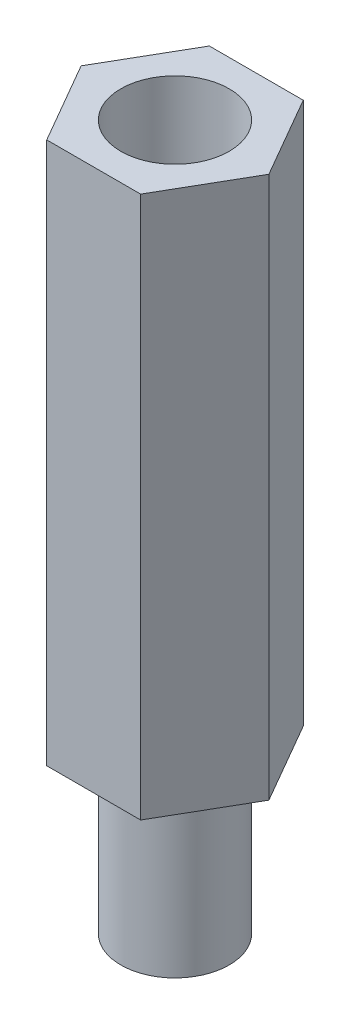
ISO-10303-21;
HEADER;
FILE_DESCRIPTION(('STEP AP214'),'2;1');
FILE_NAME('part.step','',(''),(''),'','','');
FILE_SCHEMA(('AUTOMOTIVE_DESIGN { 1 0 10303 214 1 1 1 1 }'));
ENDSEC;
DATA;
#1=APPLICATION_CONTEXT('core data for automotive mechanical design processes');
#2=APPLICATION_PROTOCOL_DEFINITION('international standard','automotive_design',2000,#1);
#3=PRODUCT_CONTEXT('',#1,'mechanical');
#4=PRODUCT('Part','Part','',(#3));
#5=PRODUCT_RELATED_PRODUCT_CATEGORY('part','',(#4));
#6=PRODUCT_DEFINITION_FORMATION('','',#4);
#7=PRODUCT_DEFINITION_CONTEXT('part definition',#1,'design');
#8=PRODUCT_DEFINITION('design','',#6,#7);
#9=PRODUCT_DEFINITION_SHAPE('','',#8);
#10=(LENGTH_UNIT() NAMED_UNIT(*) SI_UNIT(.MILLI.,.METRE.));
#11=(NAMED_UNIT(*) PLANE_ANGLE_UNIT() SI_UNIT($,.RADIAN.));
#12=(NAMED_UNIT(*) SI_UNIT($,.STERADIAN.) SOLID_ANGLE_UNIT());
#13=UNCERTAINTY_MEASURE_WITH_UNIT(LENGTH_MEASURE(1.E-05),#10,'distance_accuracy_value','');
#14=(GEOMETRIC_REPRESENTATION_CONTEXT(3) GLOBAL_UNCERTAINTY_ASSIGNED_CONTEXT((#13)) GLOBAL_UNIT_ASSIGNED_CONTEXT((#10,
#11,#12)) REPRESENTATION_CONTEXT('',''));
#15=CARTESIAN_POINT('',(0.,0.,0.));
#16=DIRECTION('',(0.,0.,1.));
#17=DIRECTION('',(1.,0.,0.));
#18=AXIS2_PLACEMENT_3D('',#15,#16,#17);
#19=CARTESIAN_POINT('',(0.,20.,0.));
#20=DIRECTION('',(0.,-1.,0.));
#21=DIRECTION('',(0.,0.,-1.));
#22=AXIS2_PLACEMENT_3D('',#19,#20,#21);
#23=CYLINDRICAL_SURFACE('',#22,2.);
#24=CARTESIAN_POINT('',(0.,20.,0.));
#25=DIRECTION('',(0.,1.,0.));
#26=DIRECTION('',(0.,0.,1.));
#27=AXIS2_PLACEMENT_3D('',#24,#25,#26);
#28=CIRCLE('',#27,2.);
#29=CARTESIAN_POINT('',(0.,20.,2.));
#30=VERTEX_POINT('',#29);
#31=EDGE_CURVE('E125',#30,#30,#28,.T.);
#32=ORIENTED_EDGE('',*,*,#31,.T.);
#33=EDGE_LOOP('',(#32));
#34=FACE_BOUND('',#33,.T.);
#35=CARTESIAN_POINT('',(0.,5.,0.));
#36=DIRECTION('',(0.,-1.,0.));
#37=DIRECTION('',(0.,0.,-1.));
#38=AXIS2_PLACEMENT_3D('',#35,#36,#37);
#39=CIRCLE('',#38,2.);
#40=CARTESIAN_POINT('',(0.,5.,-2.));
#41=VERTEX_POINT('',#40);
#42=EDGE_CURVE('E230',#41,#41,#39,.T.);
#43=ORIENTED_EDGE('',*,*,#42,.T.);
#44=EDGE_LOOP('',(#43));
#45=FACE_BOUND('',#44,.T.);
#46=ADVANCED_FACE('F35',(#34,#45),#23,.F.);
#47=CARTESIAN_POINT('',(0.,20.,0.));
#48=DIRECTION('',(0.,1.,0.));
#49=DIRECTION('',(0.,0.,1.));
#50=AXIS2_PLACEMENT_3D('',#47,#48,#49);
#51=PLANE('',#50);
#52=DIRECTION('',(0.499999999999995,0.,-0.866025403784442));
#53=VECTOR('',#52,1.);
#54=CARTESIAN_POINT('',(1.73205080756891,20.,2.99999999999997));
#55=LINE('',#54,#53);
#56=CARTESIAN_POINT('',(1.73205080756891,20.,2.99999999999997));
#57=VERTEX_POINT('',#56);
#58=CARTESIAN_POINT('',(3.46410161513774,20.,0.));
#59=VERTEX_POINT('',#58);
#60=EDGE_CURVE('E132',#57,#59,#55,.T.);
#61=ORIENTED_EDGE('',*,*,#60,.T.);
#62=DIRECTION('',(-0.500000000000001,0.,-0.866025403784438));
#63=VECTOR('',#62,1.);
#64=CARTESIAN_POINT('',(3.46410161513774,20.,0.));
#65=LINE('',#64,#63);
#66=CARTESIAN_POINT('',(1.73205080756886,20.,-2.99999999999999));
#67=VERTEX_POINT('',#66);
#68=EDGE_CURVE('E89',#59,#67,#65,.T.);
#69=ORIENTED_EDGE('',*,*,#68,.T.);
#70=DIRECTION('',(-1.,0.,0.));
#71=VECTOR('',#70,1.);
#72=CARTESIAN_POINT('',(1.73205080756886,20.,-2.99999999999999));
#73=LINE('',#72,#71);
#74=CARTESIAN_POINT('',(-1.73205080756889,20.,-2.99999999999998));
#75=VERTEX_POINT('',#74);
#76=EDGE_CURVE('E103',#67,#75,#73,.T.);
#77=ORIENTED_EDGE('',*,*,#76,.T.);
#78=DIRECTION('',(-0.499999999999995,0.,0.866025403784442));
#79=VECTOR('',#78,1.);
#80=CARTESIAN_POINT('',(-1.73205080756889,20.,-2.99999999999998));
#81=LINE('',#80,#79);
#82=CARTESIAN_POINT('',(-3.46410161513774,20.,0.));
#83=VERTEX_POINT('',#82);
#84=EDGE_CURVE('E96',#75,#83,#81,.T.);
#85=ORIENTED_EDGE('',*,*,#84,.T.);
#86=DIRECTION('',(0.500000000000007,0.,0.866025403784435));
#87=VECTOR('',#86,1.);
#88=CARTESIAN_POINT('',(-3.46410161513774,20.,0.));
#89=LINE('',#88,#87);
#90=CARTESIAN_POINT('',(-1.73205080756884,20.,3.00000000000001));
#91=VERTEX_POINT('',#90);
#92=EDGE_CURVE('E101',#83,#91,#89,.T.);
#93=ORIENTED_EDGE('',*,*,#92,.T.);
#94=DIRECTION('',(1.,0.,0.));
#95=VECTOR('',#94,1.);
#96=CARTESIAN_POINT('',(-1.73205080756884,20.,3.00000000000001));
#97=LINE('',#96,#95);
#98=EDGE_CURVE('E52',#91,#57,#97,.T.);
#99=ORIENTED_EDGE('',*,*,#98,.T.);
#100=EDGE_LOOP('',(#61,#69,#77,#85,#93,#99));
#101=FACE_BOUND('',#100,.T.);
#102=ORIENTED_EDGE('',*,*,#31,.F.);
#103=EDGE_LOOP('',(#102));
#104=FACE_BOUND('',#103,.T.);
#105=ADVANCED_FACE('F98',(#101,#104),#51,.T.);
#106=CARTESIAN_POINT('',(0.,0.,0.));
#107=DIRECTION('',(0.,1.,0.));
#108=DIRECTION('',(0.,0.,1.));
#109=AXIS2_PLACEMENT_3D('',#106,#107,#108);
#110=PLANE('',#109);
#111=DIRECTION('',(0.499999999999995,0.,-0.866025403784442));
#112=VECTOR('',#111,1.);
#113=CARTESIAN_POINT('',(1.73205080756891,0.,2.99999999999997));
#114=LINE('',#113,#112);
#115=CARTESIAN_POINT('',(1.73205080756891,0.,2.99999999999997));
#116=VERTEX_POINT('',#115);
#117=CARTESIAN_POINT('',(3.46410161513774,0.,0.));
#118=VERTEX_POINT('',#117);
#119=EDGE_CURVE('E121',#116,#118,#114,.T.);
#120=ORIENTED_EDGE('',*,*,#119,.F.);
#121=DIRECTION('',(1.,0.,0.));
#122=VECTOR('',#121,1.);
#123=CARTESIAN_POINT('',(-1.73205080756884,0.,3.00000000000001));
#124=LINE('',#123,#122);
#125=CARTESIAN_POINT('',(-1.73205080756884,0.,3.00000000000001));
#126=VERTEX_POINT('',#125);
#127=EDGE_CURVE('E81',#126,#116,#124,.T.);
#128=ORIENTED_EDGE('',*,*,#127,.F.);
#129=DIRECTION('',(0.500000000000007,0.,0.866025403784435));
#130=VECTOR('',#129,1.);
#131=CARTESIAN_POINT('',(-3.46410161513774,0.,0.));
#132=LINE('',#131,#130);
#133=CARTESIAN_POINT('',(-3.46410161513774,0.,0.));
#134=VERTEX_POINT('',#133);
#135=EDGE_CURVE('E75',#134,#126,#132,.T.);
#136=ORIENTED_EDGE('',*,*,#135,.F.);
#137=DIRECTION('',(-0.499999999999995,0.,0.866025403784442));
#138=VECTOR('',#137,1.);
#139=CARTESIAN_POINT('',(-1.73205080756889,0.,-2.99999999999998));
#140=LINE('',#139,#138);
#141=CARTESIAN_POINT('',(-1.73205080756889,0.,-2.99999999999998));
#142=VERTEX_POINT('',#141);
#143=EDGE_CURVE('E111',#142,#134,#140,.T.);
#144=ORIENTED_EDGE('',*,*,#143,.F.);
#145=DIRECTION('',(-1.,0.,0.));
#146=VECTOR('',#145,1.);
#147=CARTESIAN_POINT('',(1.73205080756886,0.,-2.99999999999999));
#148=LINE('',#147,#146);
#149=CARTESIAN_POINT('',(1.73205080756886,0.,-2.99999999999999));
#150=VERTEX_POINT('',#149);
#151=EDGE_CURVE('E127',#150,#142,#148,.T.);
#152=ORIENTED_EDGE('',*,*,#151,.F.);
#153=DIRECTION('',(-0.500000000000001,0.,-0.866025403784438));
#154=VECTOR('',#153,1.);
#155=CARTESIAN_POINT('',(3.46410161513774,0.,0.));
#156=LINE('',#155,#154);
#157=EDGE_CURVE('E124',#118,#150,#156,.T.);
#158=ORIENTED_EDGE('',*,*,#157,.F.);
#159=EDGE_LOOP('',(#120,#128,#136,#144,#152,#158));
#160=FACE_BOUND('',#159,.T.);
#161=CARTESIAN_POINT('',(0.,0.,0.));
#162=DIRECTION('',(0.,1.,0.));
#163=DIRECTION('',(0.,0.,1.));
#164=AXIS2_PLACEMENT_3D('',#161,#162,#163);
#165=CIRCLE('',#164,2.);
#166=CARTESIAN_POINT('',(0.,0.,2.));
#167=VERTEX_POINT('',#166);
#168=EDGE_CURVE('E233',#167,#167,#165,.T.);
#169=ORIENTED_EDGE('',*,*,#168,.T.);
#170=EDGE_LOOP('',(#169));
#171=FACE_BOUND('',#170,.T.);
#172=ADVANCED_FACE('F141',(#160,#171),#110,.F.);
#173=CARTESIAN_POINT('',(1.73205080756891,20.,2.99999999999997));
#174=DIRECTION('',(-0.866025403784442,0.,-0.499999999999995));
#175=DIRECTION('',(-0.499999999999995,0.,0.866025403784442));
#176=AXIS2_PLACEMENT_3D('',#173,#174,#175);
#177=PLANE('',#176);
#178=ORIENTED_EDGE('',*,*,#119,.T.);
#179=DIRECTION('',(0.,-1.,0.));
#180=VECTOR('',#179,1.);
#181=CARTESIAN_POINT('',(3.46410161513774,20.,0.));
#182=LINE('',#181,#180);
#183=EDGE_CURVE('E11',#59,#118,#182,.T.);
#184=ORIENTED_EDGE('',*,*,#183,.F.);
#185=ORIENTED_EDGE('',*,*,#60,.F.);
#186=DIRECTION('',(0.,-1.,0.));
#187=VECTOR('',#186,1.);
#188=CARTESIAN_POINT('',(1.73205080756891,20.,2.99999999999997));
#189=LINE('',#188,#187);
#190=EDGE_CURVE('E117',#57,#116,#189,.T.);
#191=ORIENTED_EDGE('',*,*,#190,.T.);
#192=EDGE_LOOP('',(#178,#184,#185,#191));
#193=FACE_BOUND('',#192,.T.);
#194=ADVANCED_FACE('F37',(#193),#177,.F.);
#195=CARTESIAN_POINT('',(3.46410161513774,20.,0.));
#196=DIRECTION('',(-0.866025403784438,0.,0.500000000000001));
#197=DIRECTION('',(0.500000000000001,0.,0.866025403784438));
#198=AXIS2_PLACEMENT_3D('',#195,#196,#197);
#199=PLANE('',#198);
#200=ORIENTED_EDGE('',*,*,#157,.T.);
#201=DIRECTION('',(0.,-1.,0.));
#202=VECTOR('',#201,1.);
#203=CARTESIAN_POINT('',(1.73205080756886,20.,-2.99999999999999));
#204=LINE('',#203,#202);
#205=EDGE_CURVE('E44',#67,#150,#204,.T.);
#206=ORIENTED_EDGE('',*,*,#205,.F.);
#207=ORIENTED_EDGE('',*,*,#68,.F.);
#208=ORIENTED_EDGE('',*,*,#183,.T.);
#209=EDGE_LOOP('',(#200,#206,#207,#208));
#210=FACE_BOUND('',#209,.T.);
#211=ADVANCED_FACE('F173',(#210),#199,.F.);
#212=CARTESIAN_POINT('',(1.73205080756886,20.,-2.99999999999999));
#213=DIRECTION('',(0.,0.,1.));
#214=DIRECTION('',(1.,0.,0.));
#215=AXIS2_PLACEMENT_3D('',#212,#213,#214);
#216=PLANE('',#215);
#217=ORIENTED_EDGE('',*,*,#151,.T.);
#218=DIRECTION('',(0.,-1.,0.));
#219=VECTOR('',#218,1.);
#220=CARTESIAN_POINT('',(-1.73205080756889,20.,-2.99999999999998));
#221=LINE('',#220,#219);
#222=EDGE_CURVE('E112',#75,#142,#221,.T.);
#223=ORIENTED_EDGE('',*,*,#222,.F.);
#224=ORIENTED_EDGE('',*,*,#76,.F.);
#225=ORIENTED_EDGE('',*,*,#205,.T.);
#226=EDGE_LOOP('',(#217,#223,#224,#225));
#227=FACE_BOUND('',#226,.T.);
#228=ADVANCED_FACE('F138',(#227),#216,.F.);
#229=CARTESIAN_POINT('',(-1.73205080756889,20.,-2.99999999999998));
#230=DIRECTION('',(0.866025403784442,0.,0.499999999999995));
#231=DIRECTION('',(0.499999999999995,0.,-0.866025403784442));
#232=AXIS2_PLACEMENT_3D('',#229,#230,#231);
#233=PLANE('',#232);
#234=ORIENTED_EDGE('',*,*,#143,.T.);
#235=DIRECTION('',(0.,-1.,0.));
#236=VECTOR('',#235,1.);
#237=CARTESIAN_POINT('',(-3.46410161513774,20.,0.));
#238=LINE('',#237,#236);
#239=EDGE_CURVE('E108',#83,#134,#238,.T.);
#240=ORIENTED_EDGE('',*,*,#239,.F.);
#241=ORIENTED_EDGE('',*,*,#84,.F.);
#242=ORIENTED_EDGE('',*,*,#222,.T.);
#243=EDGE_LOOP('',(#234,#240,#241,#242));
#244=FACE_BOUND('',#243,.T.);
#245=ADVANCED_FACE('F109',(#244),#233,.F.);
#246=CARTESIAN_POINT('',(-3.46410161513774,20.,0.));
#247=DIRECTION('',(0.866025403784434,0.,-0.500000000000007));
#248=DIRECTION('',(-0.500000000000007,0.,-0.866025403784435));
#249=AXIS2_PLACEMENT_3D('',#246,#247,#248);
#250=PLANE('',#249);
#251=ORIENTED_EDGE('',*,*,#135,.T.);
#252=DIRECTION('',(0.,-1.,0.));
#253=VECTOR('',#252,1.);
#254=CARTESIAN_POINT('',(-1.73205080756884,20.,3.00000000000001));
#255=LINE('',#254,#253);
#256=EDGE_CURVE('E113',#91,#126,#255,.T.);
#257=ORIENTED_EDGE('',*,*,#256,.F.);
#258=ORIENTED_EDGE('',*,*,#92,.F.);
#259=ORIENTED_EDGE('',*,*,#239,.T.);
#260=EDGE_LOOP('',(#251,#257,#258,#259));
#261=FACE_BOUND('',#260,.T.);
#262=ADVANCED_FACE('F115',(#261),#250,.F.);
#263=CARTESIAN_POINT('',(-1.73205080756884,20.,3.00000000000001));
#264=DIRECTION('',(0.,0.,-1.));
#265=DIRECTION('',(-1.,0.,0.));
#266=AXIS2_PLACEMENT_3D('',#263,#264,#265);
#267=PLANE('',#266);
#268=ORIENTED_EDGE('',*,*,#127,.T.);
#269=ORIENTED_EDGE('',*,*,#190,.F.);
#270=ORIENTED_EDGE('',*,*,#98,.F.);
#271=ORIENTED_EDGE('',*,*,#256,.T.);
#272=EDGE_LOOP('',(#268,#269,#270,#271));
#273=FACE_BOUND('',#272,.T.);
#274=ADVANCED_FACE('F146',(#273),#267,.F.);
#275=CARTESIAN_POINT('',(0.,5.,0.));
#276=DIRECTION('',(0.,-1.,0.));
#277=DIRECTION('',(0.,0.,-1.));
#278=AXIS2_PLACEMENT_3D('',#275,#276,#277);
#279=PLANE('',#278);
#280=ORIENTED_EDGE('',*,*,#42,.F.);
#281=EDGE_LOOP('',(#280));
#282=FACE_BOUND('',#281,.T.);
#283=ADVANCED_FACE('F148',(#282),#279,.F.);
#284=CARTESIAN_POINT('',(0.,5.,0.));
#285=DIRECTION('',(0.,-1.,0.));
#286=DIRECTION('',(0.,0.,-1.));
#287=AXIS2_PLACEMENT_3D('',#284,#285,#286);
#288=CYLINDRICAL_SURFACE('',#287,2.);
#289=CARTESIAN_POINT('',(0.,-6.,0.));
#290=DIRECTION('',(0.,-1.,0.));
#291=DIRECTION('',(0.,0.,-1.));
#292=AXIS2_PLACEMENT_3D('',#289,#290,#291);
#293=CIRCLE('',#292,2.);
#294=CARTESIAN_POINT('',(0.,-6.,-2.));
#295=VERTEX_POINT('',#294);
#296=EDGE_CURVE('E229',#295,#295,#293,.T.);
#297=ORIENTED_EDGE('',*,*,#296,.F.);
#298=EDGE_LOOP('',(#297));
#299=FACE_BOUND('',#298,.T.);
#300=ORIENTED_EDGE('',*,*,#168,.F.);
#301=EDGE_LOOP('',(#300));
#302=FACE_BOUND('',#301,.T.);
#303=ADVANCED_FACE('F154',(#299,#302),#288,.T.);
#304=CARTESIAN_POINT('',(0.,-6.,0.));
#305=DIRECTION('',(0.,-1.,0.));
#306=DIRECTION('',(0.,0.,-1.));
#307=AXIS2_PLACEMENT_3D('',#304,#305,#306);
#308=PLANE('',#307);
#309=ORIENTED_EDGE('',*,*,#296,.T.);
#310=EDGE_LOOP('',(#309));
#311=FACE_BOUND('',#310,.T.);
#312=ADVANCED_FACE('F214',(#311),#308,.T.);
#313=CLOSED_SHELL('',(#46,#105,#172,#194,#211,#228,#245,#262,#274,#283,#303,#312));
#314=MANIFOLD_SOLID_BREP('B2',#313);
#315=ADVANCED_BREP_SHAPE_REPRESENTATION('',(#18,#314),#14);
#316=SHAPE_DEFINITION_REPRESENTATION(#9,#315);
ENDSEC;
END-ISO-10303-21;
